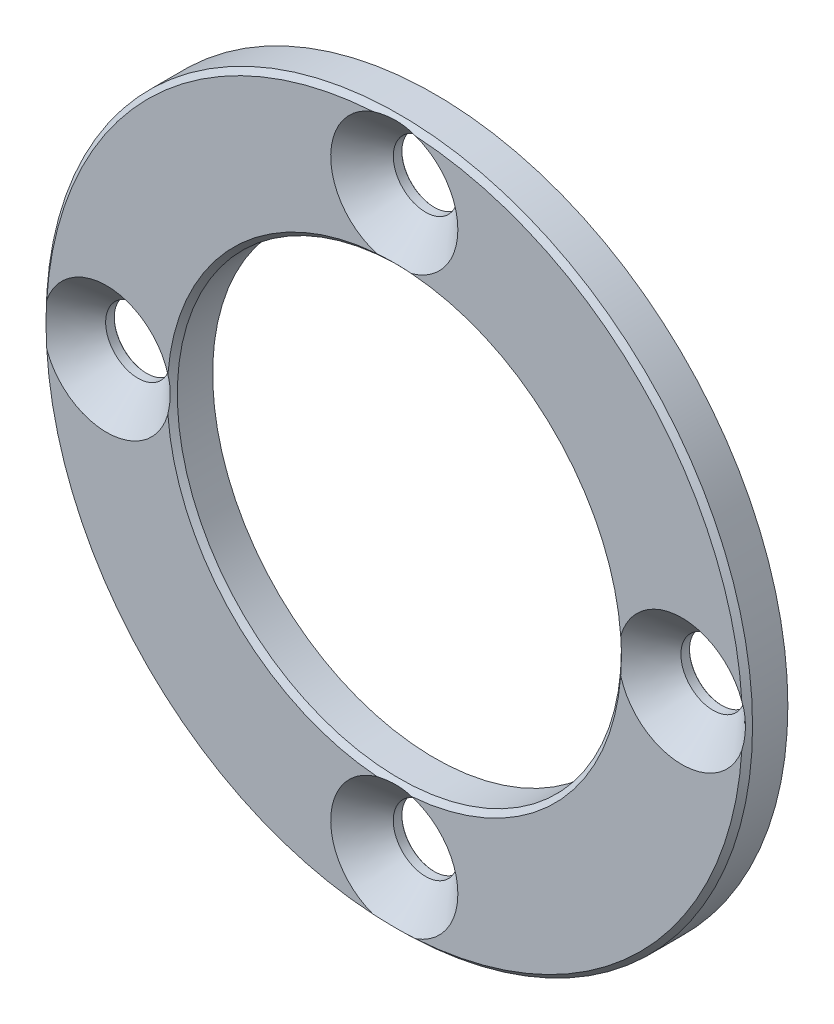
ISO-10303-21;
HEADER;
FILE_DESCRIPTION(('STEP AP214'),'2;1');
FILE_NAME('part.step','',(''),(''),'','','');
FILE_SCHEMA(('AUTOMOTIVE_DESIGN { 1 0 10303 214 1 1 1 1 }'));
ENDSEC;
DATA;
#1=APPLICATION_CONTEXT('core data for automotive mechanical design processes');
#2=APPLICATION_PROTOCOL_DEFINITION('international standard','automotive_design',2000,#1);
#3=PRODUCT_CONTEXT('',#1,'mechanical');
#4=PRODUCT('Part','Part','',(#3));
#5=PRODUCT_RELATED_PRODUCT_CATEGORY('part','',(#4));
#6=PRODUCT_DEFINITION_FORMATION('','',#4);
#7=PRODUCT_DEFINITION_CONTEXT('part definition',#1,'design');
#8=PRODUCT_DEFINITION('design','',#6,#7);
#9=PRODUCT_DEFINITION_SHAPE('','',#8);
#10=(LENGTH_UNIT() NAMED_UNIT(*) SI_UNIT(.MILLI.,.METRE.));
#11=(NAMED_UNIT(*) PLANE_ANGLE_UNIT() SI_UNIT($,.RADIAN.));
#12=(NAMED_UNIT(*) SI_UNIT($,.STERADIAN.) SOLID_ANGLE_UNIT());
#13=UNCERTAINTY_MEASURE_WITH_UNIT(LENGTH_MEASURE(1.E-05),#10,'distance_accuracy_value','');
#14=(GEOMETRIC_REPRESENTATION_CONTEXT(3) GLOBAL_UNCERTAINTY_ASSIGNED_CONTEXT((#13)) GLOBAL_UNIT_ASSIGNED_CONTEXT((#10,
#11,#12)) REPRESENTATION_CONTEXT('',''));
#15=CARTESIAN_POINT('',(0.,0.,0.));
#16=DIRECTION('',(0.,0.,1.));
#17=DIRECTION('',(1.,0.,0.));
#18=AXIS2_PLACEMENT_3D('',#15,#16,#17);
#19=CARTESIAN_POINT('',(0.,0.,2.));
#20=DIRECTION('',(0.,0.,1.));
#21=DIRECTION('',(1.,0.,0.));
#22=AXIS2_PLACEMENT_3D('',#19,#20,#21);
#23=PLANE('',#22);
#24=CARTESIAN_POINT('',(0.,14.25,2.));
#25=DIRECTION('',(0.,0.,1.));
#26=DIRECTION('',(1.,0.,0.));
#27=AXIS2_PLACEMENT_3D('',#24,#25,#26);
#28=CIRCLE('',#27,3.15);
#29=CARTESIAN_POINT('',(-1.05624940787408,17.2176315789474,2.));
#30=VERTEX_POINT('',#29);
#31=CARTESIAN_POINT('',(-0.852784708471473,11.2176315789474,2.));
#32=VERTEX_POINT('',#31);
#33=EDGE_CURVE('E149',#30,#32,#28,.T.);
#34=ORIENTED_EDGE('',*,*,#33,.F.);
#35=CARTESIAN_POINT('',(0.,0.,2.));
#36=DIRECTION('',(0.,0.,1.));
#37=DIRECTION('',(1.,0.,0.));
#38=AXIS2_PLACEMENT_3D('',#35,#36,#37);
#39=CIRCLE('',#38,17.25);
#40=CARTESIAN_POINT('',(-17.2176315789474,1.05624940787408,2.));
#41=VERTEX_POINT('',#40);
#42=EDGE_CURVE('E155',#30,#41,#39,.T.);
#43=ORIENTED_EDGE('',*,*,#42,.T.);
#44=CARTESIAN_POINT('',(-14.25,0.,2.));
#45=DIRECTION('',(0.,0.,1.));
#46=DIRECTION('',(1.,0.,0.));
#47=AXIS2_PLACEMENT_3D('',#44,#45,#46);
#48=CIRCLE('',#47,3.15);
#49=CARTESIAN_POINT('',(-11.2176315789474,0.852784708471474,2.));
#50=VERTEX_POINT('',#49);
#51=EDGE_CURVE('E298',#50,#41,#48,.T.);
#52=ORIENTED_EDGE('',*,*,#51,.F.);
#53=CARTESIAN_POINT('',(0.,0.,2.));
#54=DIRECTION('',(0.,0.,1.));
#55=DIRECTION('',(1.,0.,0.));
#56=AXIS2_PLACEMENT_3D('',#53,#54,#55);
#57=CIRCLE('',#56,11.25);
#58=EDGE_CURVE('E277',#50,#32,#57,.F.);
#59=ORIENTED_EDGE('',*,*,#58,.T.);
#60=EDGE_LOOP('',(#34,#43,#52,#59));
#61=FACE_BOUND('',#60,.T.);
#62=ADVANCED_FACE('F43',(#61),#23,.T.);
#63=CARTESIAN_POINT('',(-17.2176315789474,-1.05624940787408,2.));
#64=VERTEX_POINT('',#63);
#65=CARTESIAN_POINT('',(-11.2176315789474,-0.852784708471473,2.));
#66=VERTEX_POINT('',#65);
#67=EDGE_CURVE('E300',#64,#66,#48,.T.);
#68=ORIENTED_EDGE('',*,*,#67,.F.);
#69=CARTESIAN_POINT('',(0.,0.,2.));
#70=DIRECTION('',(0.,0.,1.));
#71=DIRECTION('',(1.,0.,0.));
#72=AXIS2_PLACEMENT_3D('',#69,#70,#71);
#73=CIRCLE('',#72,17.25);
#74=CARTESIAN_POINT('',(-1.05624940787408,-17.2176315789474,2.));
#75=VERTEX_POINT('',#74);
#76=EDGE_CURVE('E268',#64,#75,#73,.T.);
#77=ORIENTED_EDGE('',*,*,#76,.T.);
#78=CARTESIAN_POINT('',(0.,-14.25,2.));
#79=DIRECTION('',(0.,0.,1.));
#80=DIRECTION('',(1.,0.,0.));
#81=AXIS2_PLACEMENT_3D('',#78,#79,#80);
#82=CIRCLE('',#81,3.15);
#83=CARTESIAN_POINT('',(-0.852784708471472,-11.2176315789474,2.));
#84=VERTEX_POINT('',#83);
#85=EDGE_CURVE('E312',#84,#75,#82,.T.);
#86=ORIENTED_EDGE('',*,*,#85,.F.);
#87=CARTESIAN_POINT('',(0.,0.,2.));
#88=DIRECTION('',(0.,0.,1.));
#89=DIRECTION('',(1.,0.,0.));
#90=AXIS2_PLACEMENT_3D('',#87,#88,#89);
#91=CIRCLE('',#90,11.25);
#92=EDGE_CURVE('E139',#84,#66,#91,.F.);
#93=ORIENTED_EDGE('',*,*,#92,.T.);
#94=EDGE_LOOP('',(#68,#77,#86,#93));
#95=FACE_BOUND('',#94,.T.);
#96=ADVANCED_FACE('F374',(#95),#23,.T.);
#97=CARTESIAN_POINT('',(1.05624940787408,-17.2176315789474,2.));
#98=VERTEX_POINT('',#97);
#99=CARTESIAN_POINT('',(0.852784708471475,-11.2176315789474,2.));
#100=VERTEX_POINT('',#99);
#101=EDGE_CURVE('E313',#98,#100,#82,.T.);
#102=ORIENTED_EDGE('',*,*,#101,.F.);
#103=CARTESIAN_POINT('',(0.,0.,2.));
#104=DIRECTION('',(0.,0.,1.));
#105=DIRECTION('',(1.,0.,0.));
#106=AXIS2_PLACEMENT_3D('',#103,#104,#105);
#107=CIRCLE('',#106,17.25);
#108=CARTESIAN_POINT('',(17.2176315789474,-1.05624940787407,2.));
#109=VERTEX_POINT('',#108);
#110=EDGE_CURVE('E138',#98,#109,#107,.T.);
#111=ORIENTED_EDGE('',*,*,#110,.T.);
#112=CARTESIAN_POINT('',(14.25,0.,2.));
#113=DIRECTION('',(0.,0.,1.));
#114=DIRECTION('',(1.,0.,0.));
#115=AXIS2_PLACEMENT_3D('',#112,#113,#114);
#116=CIRCLE('',#115,3.15);
#117=CARTESIAN_POINT('',(11.2176315789474,-0.852784708471466,2.));
#118=VERTEX_POINT('',#117);
#119=EDGE_CURVE('E328',#118,#109,#116,.T.);
#120=ORIENTED_EDGE('',*,*,#119,.F.);
#121=CARTESIAN_POINT('',(0.,0.,2.));
#122=DIRECTION('',(0.,0.,1.));
#123=DIRECTION('',(1.,0.,0.));
#124=AXIS2_PLACEMENT_3D('',#121,#122,#123);
#125=CIRCLE('',#124,11.25);
#126=EDGE_CURVE('E283',#118,#100,#125,.F.);
#127=ORIENTED_EDGE('',*,*,#126,.T.);
#128=EDGE_LOOP('',(#102,#111,#120,#127));
#129=FACE_BOUND('',#128,.T.);
#130=ADVANCED_FACE('F378',(#129),#23,.T.);
#131=CARTESIAN_POINT('',(17.2176315789474,1.05624940787407,2.));
#132=VERTEX_POINT('',#131);
#133=CARTESIAN_POINT('',(11.2176315789474,0.852784708471467,2.));
#134=VERTEX_POINT('',#133);
#135=EDGE_CURVE('E133',#132,#134,#116,.T.);
#136=ORIENTED_EDGE('',*,*,#135,.F.);
#137=CARTESIAN_POINT('',(0.,0.,2.));
#138=DIRECTION('',(0.,0.,1.));
#139=DIRECTION('',(1.,0.,0.));
#140=AXIS2_PLACEMENT_3D('',#137,#138,#139);
#141=CIRCLE('',#140,17.25);
#142=CARTESIAN_POINT('',(1.05624940787408,17.2176315789474,2.));
#143=VERTEX_POINT('',#142);
#144=EDGE_CURVE('E127',#132,#143,#141,.T.);
#145=ORIENTED_EDGE('',*,*,#144,.T.);
#146=CARTESIAN_POINT('',(0.852784708471473,11.2176315789474,2.));
#147=VERTEX_POINT('',#146);
#148=EDGE_CURVE('E130',#147,#143,#28,.T.);
#149=ORIENTED_EDGE('',*,*,#148,.F.);
#150=CARTESIAN_POINT('',(0.,0.,2.));
#151=DIRECTION('',(0.,0.,1.));
#152=DIRECTION('',(1.,0.,0.));
#153=AXIS2_PLACEMENT_3D('',#150,#151,#152);
#154=CIRCLE('',#153,11.25);
#155=EDGE_CURVE('E280',#147,#134,#154,.F.);
#156=ORIENTED_EDGE('',*,*,#155,.T.);
#157=EDGE_LOOP('',(#136,#145,#149,#156));
#158=FACE_BOUND('',#157,.T.);
#159=ADVANCED_FACE('F129',(#158),#23,.T.);
#160=CARTESIAN_POINT('',(0.,0.,0.));
#161=DIRECTION('',(0.,0.,1.));
#162=DIRECTION('',(1.,0.,0.));
#163=AXIS2_PLACEMENT_3D('',#160,#161,#162);
#164=PLANE('',#163);
#165=CARTESIAN_POINT('',(0.,14.25,0.));
#166=DIRECTION('',(0.,0.,1.));
#167=DIRECTION('',(1.,0.,0.));
#168=AXIS2_PLACEMENT_3D('',#165,#166,#167);
#169=CIRCLE('',#168,1.625);
#170=CARTESIAN_POINT('',(1.625,14.25,0.));
#171=VERTEX_POINT('',#170);
#172=EDGE_CURVE('E150',#171,#171,#169,.T.);
#173=ORIENTED_EDGE('',*,*,#172,.T.);
#174=EDGE_LOOP('',(#173));
#175=FACE_BOUND('',#174,.T.);
#176=CARTESIAN_POINT('',(14.25,0.,0.));
#177=DIRECTION('',(0.,0.,1.));
#178=DIRECTION('',(1.,0.,0.));
#179=AXIS2_PLACEMENT_3D('',#176,#177,#178);
#180=CIRCLE('',#179,1.625);
#181=CARTESIAN_POINT('',(15.875,0.,0.));
#182=VERTEX_POINT('',#181);
#183=EDGE_CURVE('E329',#182,#182,#180,.T.);
#184=ORIENTED_EDGE('',*,*,#183,.T.);
#185=EDGE_LOOP('',(#184));
#186=FACE_BOUND('',#185,.T.);
#187=CARTESIAN_POINT('',(0.,-14.25,0.));
#188=DIRECTION('',(0.,0.,1.));
#189=DIRECTION('',(1.,0.,0.));
#190=AXIS2_PLACEMENT_3D('',#187,#188,#189);
#191=CIRCLE('',#190,1.625);
#192=CARTESIAN_POINT('',(1.625,-14.25,0.));
#193=VERTEX_POINT('',#192);
#194=EDGE_CURVE('E316',#193,#193,#191,.T.);
#195=ORIENTED_EDGE('',*,*,#194,.T.);
#196=EDGE_LOOP('',(#195));
#197=FACE_BOUND('',#196,.T.);
#198=CARTESIAN_POINT('',(-14.25,0.,0.));
#199=DIRECTION('',(0.,0.,1.));
#200=DIRECTION('',(1.,0.,0.));
#201=AXIS2_PLACEMENT_3D('',#198,#199,#200);
#202=CIRCLE('',#201,1.625);
#203=CARTESIAN_POINT('',(-12.625,0.,0.));
#204=VERTEX_POINT('',#203);
#205=EDGE_CURVE('E301',#204,#204,#202,.T.);
#206=ORIENTED_EDGE('',*,*,#205,.T.);
#207=EDGE_LOOP('',(#206));
#208=FACE_BOUND('',#207,.T.);
#209=CARTESIAN_POINT('',(0.,0.,0.));
#210=DIRECTION('',(0.,0.,1.));
#211=DIRECTION('',(1.,0.,0.));
#212=AXIS2_PLACEMENT_3D('',#209,#210,#211);
#213=CIRCLE('',#212,17.5);
#214=CARTESIAN_POINT('',(17.5,0.,0.));
#215=VERTEX_POINT('',#214);
#216=EDGE_CURVE('E286',#215,#215,#213,.T.);
#217=ORIENTED_EDGE('',*,*,#216,.F.);
#218=EDGE_LOOP('',(#217));
#219=FACE_BOUND('',#218,.T.);
#220=CARTESIAN_POINT('',(0.,0.,0.));
#221=DIRECTION('',(0.,0.,1.));
#222=DIRECTION('',(1.,0.,0.));
#223=AXIS2_PLACEMENT_3D('',#220,#221,#222);
#224=CIRCLE('',#223,11.);
#225=CARTESIAN_POINT('',(11.,0.,0.));
#226=VERTEX_POINT('',#225);
#227=EDGE_CURVE('E289',#226,#226,#224,.T.);
#228=ORIENTED_EDGE('',*,*,#227,.T.);
#229=EDGE_LOOP('',(#228));
#230=FACE_BOUND('',#229,.T.);
#231=ADVANCED_FACE('F342',(#175,#186,#197,#208,#219,#230),#164,.F.);
#232=CARTESIAN_POINT('',(0.,0.,2.));
#233=DIRECTION('',(0.,0.,-1.));
#234=DIRECTION('',(-1.,0.,0.));
#235=AXIS2_PLACEMENT_3D('',#232,#233,#234);
#236=CYLINDRICAL_SURFACE('',#235,17.5);
#237=CARTESIAN_POINT('',(0.,0.,1.75));
#238=DIRECTION('',(0.,0.,1.));
#239=DIRECTION('',(1.,0.,0.));
#240=AXIS2_PLACEMENT_3D('',#237,#238,#239);
#241=CIRCLE('',#240,17.5);
#242=CARTESIAN_POINT('',(17.5,0.,1.75));
#243=VERTEX_POINT('',#242);
#244=EDGE_CURVE('E53',#243,#243,#241,.F.);
#245=ORIENTED_EDGE('',*,*,#244,.T.);
#246=EDGE_LOOP('',(#245));
#247=FACE_BOUND('',#246,.T.);
#248=ORIENTED_EDGE('',*,*,#216,.T.);
#249=EDGE_LOOP('',(#248));
#250=FACE_BOUND('',#249,.T.);
#251=ADVANCED_FACE('F349',(#247,#250),#236,.T.);
#252=CARTESIAN_POINT('',(0.,0.,2.));
#253=DIRECTION('',(0.,0.,-1.));
#254=DIRECTION('',(-1.,0.,0.));
#255=AXIS2_PLACEMENT_3D('',#252,#253,#254);
#256=CYLINDRICAL_SURFACE('',#255,11.);
#257=CARTESIAN_POINT('',(0.,0.,1.75));
#258=DIRECTION('',(0.,0.,1.));
#259=DIRECTION('',(1.,0.,0.));
#260=AXIS2_PLACEMENT_3D('',#257,#258,#259);
#261=CIRCLE('',#260,11.);
#262=CARTESIAN_POINT('',(11.,0.,1.75));
#263=VERTEX_POINT('',#262);
#264=EDGE_CURVE('E11',#263,#263,#261,.T.);
#265=ORIENTED_EDGE('',*,*,#264,.T.);
#266=EDGE_LOOP('',(#265));
#267=FACE_BOUND('',#266,.T.);
#268=ORIENTED_EDGE('',*,*,#227,.F.);
#269=EDGE_LOOP('',(#268));
#270=FACE_BOUND('',#269,.T.);
#271=ADVANCED_FACE('F361',(#267,#270),#256,.F.);
#272=CARTESIAN_POINT('',(-14.25,0.,0.0250000000000003));
#273=DIRECTION('',(0.,0.,-1.));
#274=DIRECTION('',(-1.,0.,0.));
#275=AXIS2_PLACEMENT_3D('',#272,#273,#274);
#276=CONICAL_SURFACE('',#275,1.6,0.785398163397457);
#277=ORIENTED_EDGE('',*,*,#205,.F.);
#278=EDGE_LOOP('',(#277));
#279=FACE_BOUND('',#278,.T.);
#280=CARTESIAN_POINT('',(-14.25,0.,0.0250000000000003));
#281=DIRECTION('',(0.,0.,1.));
#282=DIRECTION('',(1.,0.,0.));
#283=AXIS2_PLACEMENT_3D('',#280,#281,#282);
#284=CIRCLE('',#283,1.6);
#285=CARTESIAN_POINT('',(-12.65,0.,0.0250000000000003));
#286=VERTEX_POINT('',#285);
#287=EDGE_CURVE('E292',#286,#286,#284,.T.);
#288=ORIENTED_EDGE('',*,*,#287,.T.);
#289=EDGE_LOOP('',(#288));
#290=FACE_BOUND('',#289,.T.);
#291=ADVANCED_FACE('F363',(#279,#290),#276,.F.);
#292=CARTESIAN_POINT('',(-14.25,0.,2.));
#293=DIRECTION('',(0.,0.,1.));
#294=DIRECTION('',(1.,0.,0.));
#295=AXIS2_PLACEMENT_3D('',#292,#293,#294);
#296=CYLINDRICAL_SURFACE('',#295,1.6);
#297=ORIENTED_EDGE('',*,*,#287,.F.);
#298=EDGE_LOOP('',(#297));
#299=FACE_BOUND('',#298,.T.);
#300=CARTESIAN_POINT('',(-14.25,0.,0.45));
#301=DIRECTION('',(0.,0.,1.));
#302=DIRECTION('',(1.,0.,0.));
#303=AXIS2_PLACEMENT_3D('',#300,#301,#302);
#304=CIRCLE('',#303,1.6);
#305=CARTESIAN_POINT('',(-12.65,0.,0.45));
#306=VERTEX_POINT('',#305);
#307=EDGE_CURVE('E295',#306,#306,#304,.T.);
#308=ORIENTED_EDGE('',*,*,#307,.T.);
#309=EDGE_LOOP('',(#308));
#310=FACE_BOUND('',#309,.T.);
#311=ADVANCED_FACE('F248',(#299,#310),#296,.F.);
#312=CARTESIAN_POINT('',(-14.25,0.,2.));
#313=DIRECTION('',(0.,0.,1.));
#314=DIRECTION('',(1.,0.,0.));
#315=AXIS2_PLACEMENT_3D('',#312,#313,#314);
#316=CONICAL_SURFACE('',#315,3.15,0.785398163397449);
#317=ORIENTED_EDGE('',*,*,#307,.F.);
#318=EDGE_LOOP('',(#317));
#319=FACE_BOUND('',#318,.T.);
#320=ORIENTED_EDGE('',*,*,#51,.T.);
#321=CARTESIAN_POINT('',(-17.2176315789474,1.05624940787408,2.));
#322=CARTESIAN_POINT('',(-17.2423305317793,0.935563844195699,1.98274705499936));
#323=CARTESIAN_POINT('',(-17.2629079946694,0.8135997368502,1.96837309197479));
#324=CARTESIAN_POINT('',(-17.2955299071514,0.567926341024394,1.94558572668355));
#325=CARTESIAN_POINT('',(-17.3075701297683,0.44421621892616,1.93717527708322));
#326=CARTESIAN_POINT('',(-17.3226464780269,0.198526364411612,1.92664400437944));
#327=CARTESIAN_POINT('',(-17.3258619995738,0.0765630978836639,1.92439786796129));
#328=CARTESIAN_POINT('',(-17.3237448866351,-0.167187756970835,1.92587673358402));
#329=CARTESIAN_POINT('',(-17.3184170219598,-0.288975405355205,1.92959840377203));
#330=CARTESIAN_POINT('',(-17.30034969676,-0.51860911910319,1.94221896182742));
#331=CARTESIAN_POINT('',(-17.288461314569,-0.626556770387878,1.95052334644796));
#332=CARTESIAN_POINT('',(-17.2580342767816,-0.842089249718741,1.97177752725457));
#333=CARTESIAN_POINT('',(-17.2394345480596,-0.949661273353213,1.98476998481498));
#334=CARTESIAN_POINT('',(-17.2176315789474,-1.05624940787408,2.));
#335=B_SPLINE_CURVE_WITH_KNOTS('',3,(#321,#322,#323,#324,#325,#326,#327,#328,#329,#330,#331,
#332,#333,#334),.UNSPECIFIED.,.F.,.F.,(4,2,2,2,2,2,4),(0.,0.373096657027261,0.746377913647571,
1.11201252652992,1.47744307505201,1.80389911672499,2.13340408830665),.UNSPECIFIED.);
#336=EDGE_CURVE('E73',#41,#64,#335,.T.);
#337=ORIENTED_EDGE('',*,*,#336,.T.);
#338=ORIENTED_EDGE('',*,*,#67,.T.);
#339=CARTESIAN_POINT('',(-11.2176315789474,-0.852784708471473,2.));
#340=CARTESIAN_POINT('',(-11.2116706721064,-0.792861181333929,1.9895132195926));
#341=CARTESIAN_POINT('',(-11.2063033885988,-0.732700887651865,1.98007077633692));
#342=CARTESIAN_POINT('',(-11.1967994686457,-0.611977390181435,1.96335091695972));
#343=CARTESIAN_POINT('',(-11.1926629655724,-0.551414143453911,1.9560737354748));
#344=CARTESIAN_POINT('',(-11.1821649457678,-0.369218639516163,1.93760499674162));
#345=CARTESIAN_POINT('',(-11.1777175941952,-0.247107192903553,1.92978095254196));
#346=CARTESIAN_POINT('',(-11.1741489333632,-0.00460473866626139,1.92350275314375));
#347=CARTESIAN_POINT('',(-11.1749408029969,0.115781343393012,1.92489585711283));
#348=CARTESIAN_POINT('',(-11.1816121257596,0.35590615911943,1.9366324434576));
#349=CARTESIAN_POINT('',(-11.1874880123912,0.475645287392892,1.94696965143973));
#350=CARTESIAN_POINT('',(-11.1987939679737,0.637815275294871,1.9668597584683));
#351=CARTESIAN_POINT('',(-11.202121714313,0.680883099531113,1.97271412702045));
#352=CARTESIAN_POINT('',(-11.2094079243818,0.766935604562902,1.98553245954293));
#353=CARTESIAN_POINT('',(-11.2133682879666,0.809919627090163,1.9924997658515));
#354=CARTESIAN_POINT('',(-11.2176315789474,0.852784708471474,2.));
#355=B_SPLINE_CURVE_WITH_KNOTS('',3,(#339,#340,#341,#342,#343,#344,#345,#346,#347,#348,#349,
#350,#351,#352,#353,#354),.UNSPECIFIED.,.F.,.F.,(4,2,2,2,2,2,2,4),(0.,0.183352767396062,
0.366725396415032,0.733551757360662,1.0943147033746,1.45482477496485,1.58558468082394,
1.71674493049115),.UNSPECIFIED.);
#356=EDGE_CURVE('E63',#66,#50,#355,.T.);
#357=ORIENTED_EDGE('',*,*,#356,.T.);
#358=EDGE_LOOP('',(#320,#337,#338,#357));
#359=FACE_BOUND('',#358,.T.);
#360=ADVANCED_FACE('F243',(#319,#359),#316,.F.);
#361=CARTESIAN_POINT('',(0.,-14.25,0.0250000000000003));
#362=DIRECTION('',(0.,0.,-1.));
#363=DIRECTION('',(-1.,0.,0.));
#364=AXIS2_PLACEMENT_3D('',#361,#362,#363);
#365=CONICAL_SURFACE('',#364,1.6,0.785398163397448);
#366=ORIENTED_EDGE('',*,*,#194,.F.);
#367=EDGE_LOOP('',(#366));
#368=FACE_BOUND('',#367,.T.);
#369=CARTESIAN_POINT('',(0.,-14.25,0.0250000000000003));
#370=DIRECTION('',(0.,0.,1.));
#371=DIRECTION('',(1.,0.,0.));
#372=AXIS2_PLACEMENT_3D('',#369,#370,#371);
#373=CIRCLE('',#372,1.6);
#374=CARTESIAN_POINT('',(1.6,-14.25,0.0250000000000003));
#375=VERTEX_POINT('',#374);
#376=EDGE_CURVE('E304',#375,#375,#373,.T.);
#377=ORIENTED_EDGE('',*,*,#376,.T.);
#378=EDGE_LOOP('',(#377));
#379=FACE_BOUND('',#378,.T.);
#380=ADVANCED_FACE('F239',(#368,#379),#365,.F.);
#381=CARTESIAN_POINT('',(0.,-14.25,2.));
#382=DIRECTION('',(0.,0.,1.));
#383=DIRECTION('',(1.,0.,0.));
#384=AXIS2_PLACEMENT_3D('',#381,#382,#383);
#385=CYLINDRICAL_SURFACE('',#384,1.6);
#386=ORIENTED_EDGE('',*,*,#376,.F.);
#387=EDGE_LOOP('',(#386));
#388=FACE_BOUND('',#387,.T.);
#389=CARTESIAN_POINT('',(0.,-14.25,0.45));
#390=DIRECTION('',(0.,0.,1.));
#391=DIRECTION('',(1.,0.,0.));
#392=AXIS2_PLACEMENT_3D('',#389,#390,#391);
#393=CIRCLE('',#392,1.6);
#394=CARTESIAN_POINT('',(1.6,-14.25,0.45));
#395=VERTEX_POINT('',#394);
#396=EDGE_CURVE('E308',#395,#395,#393,.T.);
#397=ORIENTED_EDGE('',*,*,#396,.T.);
#398=EDGE_LOOP('',(#397));
#399=FACE_BOUND('',#398,.T.);
#400=ADVANCED_FACE('F234',(#388,#399),#385,.F.);
#401=CARTESIAN_POINT('',(0.,-14.25,2.));
#402=DIRECTION('',(0.,0.,1.));
#403=DIRECTION('',(1.,0.,0.));
#404=AXIS2_PLACEMENT_3D('',#401,#402,#403);
#405=CONICAL_SURFACE('',#404,3.15,0.785398163397449);
#406=ORIENTED_EDGE('',*,*,#396,.F.);
#407=EDGE_LOOP('',(#406));
#408=FACE_BOUND('',#407,.T.);
#409=ORIENTED_EDGE('',*,*,#85,.T.);
#410=CARTESIAN_POINT('',(-1.05624940787408,-17.2176315789474,2.));
#411=CARTESIAN_POINT('',(-0.935563844195696,-17.2423305317793,1.98274705499936));
#412=CARTESIAN_POINT('',(-0.813599736850196,-17.2629079946694,1.96837309197479));
#413=CARTESIAN_POINT('',(-0.56792634102439,-17.2955299071514,1.94558572668355));
#414=CARTESIAN_POINT('',(-0.444216218926157,-17.3075701297683,1.93717527708322));
#415=CARTESIAN_POINT('',(-0.198526364411608,-17.3226464780269,1.92664400437944));
#416=CARTESIAN_POINT('',(-0.0765630978836598,-17.3258619995738,1.92439786796129));
#417=CARTESIAN_POINT('',(0.167187756970839,-17.3237448866351,1.92587673358402));
#418=CARTESIAN_POINT('',(0.28897540535521,-17.3184170219598,1.92959840377203));
#419=CARTESIAN_POINT('',(0.518609119103194,-17.30034969676,1.94221896182742));
#420=CARTESIAN_POINT('',(0.626556770387882,-17.288461314569,1.95052334644796));
#421=CARTESIAN_POINT('',(0.842089249718744,-17.2580342767816,1.97177752725457));
#422=CARTESIAN_POINT('',(0.949661273353216,-17.2394345480596,1.98476998481498));
#423=CARTESIAN_POINT('',(1.05624940787408,-17.2176315789474,2.));
#424=B_SPLINE_CURVE_WITH_KNOTS('',3,(#410,#411,#412,#413,#414,#415,#416,#417,#418,#419,#420,
#421,#422,#423),.UNSPECIFIED.,.F.,.F.,(4,2,2,2,2,2,4),(0.,0.373096657027261,0.746377913647572,
1.11201252652992,1.47744307505201,1.80389911672499,2.13340408830665),.UNSPECIFIED.);
#425=EDGE_CURVE('E208',#75,#98,#424,.T.);
#426=ORIENTED_EDGE('',*,*,#425,.T.);
#427=ORIENTED_EDGE('',*,*,#101,.T.);
#428=CARTESIAN_POINT('',(0.852784708471475,-11.2176315789474,2.));
#429=CARTESIAN_POINT('',(0.79286118133393,-11.2116706721064,1.9895132195926));
#430=CARTESIAN_POINT('',(0.732700887651866,-11.2063033885988,1.98007077633692));
#431=CARTESIAN_POINT('',(0.611977390181437,-11.1967994686457,1.96335091695972));
#432=CARTESIAN_POINT('',(0.551414143453914,-11.1926629655724,1.95607373547481));
#433=CARTESIAN_POINT('',(0.369218639516165,-11.1821649457678,1.93760499674161));
#434=CARTESIAN_POINT('',(0.247107192903555,-11.1777175941952,1.92978095254196));
#435=CARTESIAN_POINT('',(0.00460473866626384,-11.1741489333632,1.92350275314375));
#436=CARTESIAN_POINT('',(-0.11578134339301,-11.1749408029969,1.92489585711283));
#437=CARTESIAN_POINT('',(-0.355906159119427,-11.1816121257596,1.9366324434576));
#438=CARTESIAN_POINT('',(-0.475645287392889,-11.1874880123912,1.94696965143973));
#439=CARTESIAN_POINT('',(-0.637815275294868,-11.1987939679737,1.9668597584683));
#440=CARTESIAN_POINT('',(-0.68088309953111,-11.202121714313,1.97271412702044));
#441=CARTESIAN_POINT('',(-0.766935604562899,-11.2094079243818,1.98553245954293));
#442=CARTESIAN_POINT('',(-0.809919627090161,-11.2133682879666,1.99249976585151));
#443=CARTESIAN_POINT('',(-0.852784708471472,-11.2176315789474,2.));
#444=B_SPLINE_CURVE_WITH_KNOTS('',3,(#428,#429,#430,#431,#432,#433,#434,#435,#436,#437,#438,
#439,#440,#441,#442,#443),.UNSPECIFIED.,.F.,.F.,(4,2,2,2,2,2,2,4),(0.,0.183352767396062,
0.366725396415031,0.733551757360662,1.0943147033746,1.45482477496485,1.58558468082394,
1.71674493049115),.UNSPECIFIED.);
#445=EDGE_CURVE('E213',#100,#84,#444,.T.);
#446=ORIENTED_EDGE('',*,*,#445,.T.);
#447=EDGE_LOOP('',(#409,#426,#427,#446));
#448=FACE_BOUND('',#447,.T.);
#449=ADVANCED_FACE('F229',(#408,#448),#405,.F.);
#450=CARTESIAN_POINT('',(14.25,0.,0.0250000000000003));
#451=DIRECTION('',(0.,0.,-1.));
#452=DIRECTION('',(-1.,0.,0.));
#453=AXIS2_PLACEMENT_3D('',#450,#451,#452);
#454=CONICAL_SURFACE('',#453,1.6,0.785398163397457);
#455=ORIENTED_EDGE('',*,*,#183,.F.);
#456=EDGE_LOOP('',(#455));
#457=FACE_BOUND('',#456,.T.);
#458=CARTESIAN_POINT('',(14.25,0.,0.0250000000000003));
#459=DIRECTION('',(0.,0.,1.));
#460=DIRECTION('',(1.,0.,0.));
#461=AXIS2_PLACEMENT_3D('',#458,#459,#460);
#462=CIRCLE('',#461,1.6);
#463=CARTESIAN_POINT('',(15.85,0.,0.0250000000000003));
#464=VERTEX_POINT('',#463);
#465=EDGE_CURVE('E320',#464,#464,#462,.T.);
#466=ORIENTED_EDGE('',*,*,#465,.T.);
#467=EDGE_LOOP('',(#466));
#468=FACE_BOUND('',#467,.T.);
#469=ADVANCED_FACE('F233',(#457,#468),#454,.F.);
#470=CARTESIAN_POINT('',(14.25,0.,2.));
#471=DIRECTION('',(0.,0.,1.));
#472=DIRECTION('',(1.,0.,0.));
#473=AXIS2_PLACEMENT_3D('',#470,#471,#472);
#474=CYLINDRICAL_SURFACE('',#473,1.6);
#475=ORIENTED_EDGE('',*,*,#465,.F.);
#476=EDGE_LOOP('',(#475));
#477=FACE_BOUND('',#476,.T.);
#478=CARTESIAN_POINT('',(14.25,0.,0.45));
#479=DIRECTION('',(0.,0.,1.));
#480=DIRECTION('',(1.,0.,0.));
#481=AXIS2_PLACEMENT_3D('',#478,#479,#480);
#482=CIRCLE('',#481,1.6);
#483=CARTESIAN_POINT('',(15.85,0.,0.45));
#484=VERTEX_POINT('',#483);
#485=EDGE_CURVE('E324',#484,#484,#482,.T.);
#486=ORIENTED_EDGE('',*,*,#485,.T.);
#487=EDGE_LOOP('',(#486));
#488=FACE_BOUND('',#487,.T.);
#489=ADVANCED_FACE('F189',(#477,#488),#474,.F.);
#490=CARTESIAN_POINT('',(14.25,0.,2.));
#491=DIRECTION('',(0.,0.,1.));
#492=DIRECTION('',(1.,0.,0.));
#493=AXIS2_PLACEMENT_3D('',#490,#491,#492);
#494=CONICAL_SURFACE('',#493,3.15,0.785398163397448);
#495=ORIENTED_EDGE('',*,*,#485,.F.);
#496=EDGE_LOOP('',(#495));
#497=FACE_BOUND('',#496,.T.);
#498=ORIENTED_EDGE('',*,*,#119,.T.);
#499=CARTESIAN_POINT('',(17.2176315789474,-1.05624940787407,2.));
#500=CARTESIAN_POINT('',(17.2423305317793,-0.935563844195687,1.98274705499936));
#501=CARTESIAN_POINT('',(17.2629079946694,-0.813599736850187,1.96837309197479));
#502=CARTESIAN_POINT('',(17.2955299071514,-0.567926341024381,1.94558572668355));
#503=CARTESIAN_POINT('',(17.3075701297683,-0.444216218926148,1.93717527708322));
#504=CARTESIAN_POINT('',(17.3226464780269,-0.198526364411601,1.92664400437943));
#505=CARTESIAN_POINT('',(17.3258619995738,-0.0765630978836526,1.92439786796129));
#506=CARTESIAN_POINT('',(17.3237448866351,0.167187756970846,1.92587673358402));
#507=CARTESIAN_POINT('',(17.3184170219598,0.288975405355216,1.92959840377203));
#508=CARTESIAN_POINT('',(17.30034969676,0.518609119103198,1.94221896182742));
#509=CARTESIAN_POINT('',(17.288461314569,0.626556770387884,1.95052334644796));
#510=CARTESIAN_POINT('',(17.2580342767816,0.84208924971874,1.97177752725457));
#511=CARTESIAN_POINT('',(17.2394345480596,0.949661273353209,1.98476998481498));
#512=CARTESIAN_POINT('',(17.2176315789474,1.05624940787407,2.));
#513=B_SPLINE_CURVE_WITH_KNOTS('',3,(#499,#500,#501,#502,#503,#504,#505,#506,#507,#508,#509,
#510,#511,#512),.UNSPECIFIED.,.F.,.F.,(4,2,2,2,2,2,4),(0.,0.373096657027262,0.746377913647571,
1.11201252652992,1.47744307505201,1.80389911672498,2.13340408830663),.UNSPECIFIED.);
#514=EDGE_CURVE('E160',#109,#132,#513,.T.);
#515=ORIENTED_EDGE('',*,*,#514,.T.);
#516=ORIENTED_EDGE('',*,*,#135,.T.);
#517=CARTESIAN_POINT('',(11.2176315789474,0.852784708471467,2.));
#518=CARTESIAN_POINT('',(11.2116706721064,0.792861181333923,1.9895132195926));
#519=CARTESIAN_POINT('',(11.2063033885988,0.732700887651859,1.98007077633692));
#520=CARTESIAN_POINT('',(11.1967994686457,0.61197739018143,1.96335091695972));
#521=CARTESIAN_POINT('',(11.1926629655724,0.551414143453906,1.95607373547481));
#522=CARTESIAN_POINT('',(11.1821649457678,0.369218639516158,1.93760499674161));
#523=CARTESIAN_POINT('',(11.1777175941952,0.247107192903549,1.92978095254196));
#524=CARTESIAN_POINT('',(11.1741489333632,0.00460473866625755,1.92350275314375));
#525=CARTESIAN_POINT('',(11.1749408029969,-0.115781343393016,1.92489585711283));
#526=CARTESIAN_POINT('',(11.1816121257596,-0.355906159119433,1.93663244345761));
#527=CARTESIAN_POINT('',(11.1874880123912,-0.475645287392894,1.94696965143973));
#528=CARTESIAN_POINT('',(11.1987939679737,-0.637815275294872,1.9668597584683));
#529=CARTESIAN_POINT('',(11.202121714313,-0.680883099531112,1.97271412702045));
#530=CARTESIAN_POINT('',(11.2094079243818,-0.766935604562897,1.98553245954293));
#531=CARTESIAN_POINT('',(11.2133682879666,-0.809919627090157,1.9924997658515));
#532=CARTESIAN_POINT('',(11.2176315789474,-0.852784708471466,2.));
#533=B_SPLINE_CURVE_WITH_KNOTS('',3,(#517,#518,#519,#520,#521,#522,#523,#524,#525,#526,#527,
#528,#529,#530,#531,#532),.UNSPECIFIED.,.F.,.F.,(4,2,2,2,2,2,2,4),(0.,0.183352767396062,
0.366725396415031,0.733551757360661,1.09431470337459,1.45482477496485,1.58558468082393,
1.71674493049114),.UNSPECIFIED.);
#534=EDGE_CURVE('E194',#134,#118,#533,.T.);
#535=ORIENTED_EDGE('',*,*,#534,.T.);
#536=EDGE_LOOP('',(#498,#515,#516,#535));
#537=FACE_BOUND('',#536,.T.);
#538=ADVANCED_FACE('F184',(#497,#537),#494,.F.);
#539=CARTESIAN_POINT('',(0.,14.25,0.0250000000000003));
#540=DIRECTION('',(0.,0.,-1.));
#541=DIRECTION('',(-1.,0.,0.));
#542=AXIS2_PLACEMENT_3D('',#539,#540,#541);
#543=CONICAL_SURFACE('',#542,1.6,0.785398163397448);
#544=ORIENTED_EDGE('',*,*,#172,.F.);
#545=EDGE_LOOP('',(#544));
#546=FACE_BOUND('',#545,.T.);
#547=CARTESIAN_POINT('',(0.,14.25,0.0250000000000003));
#548=DIRECTION('',(0.,0.,1.));
#549=DIRECTION('',(1.,0.,0.));
#550=AXIS2_PLACEMENT_3D('',#547,#548,#549);
#551=CIRCLE('',#550,1.6);
#552=CARTESIAN_POINT('',(1.6,14.25,0.0250000000000003));
#553=VERTEX_POINT('',#552);
#554=EDGE_CURVE('E333',#553,#553,#551,.T.);
#555=ORIENTED_EDGE('',*,*,#554,.T.);
#556=EDGE_LOOP('',(#555));
#557=FACE_BOUND('',#556,.T.);
#558=ADVANCED_FACE('F180',(#546,#557),#543,.F.);
#559=CARTESIAN_POINT('',(0.,14.25,2.));
#560=DIRECTION('',(0.,0.,1.));
#561=DIRECTION('',(1.,0.,0.));
#562=AXIS2_PLACEMENT_3D('',#559,#560,#561);
#563=CYLINDRICAL_SURFACE('',#562,1.6);
#564=ORIENTED_EDGE('',*,*,#554,.F.);
#565=EDGE_LOOP('',(#564));
#566=FACE_BOUND('',#565,.T.);
#567=CARTESIAN_POINT('',(0.,14.25,0.45));
#568=DIRECTION('',(0.,0.,1.));
#569=DIRECTION('',(1.,0.,0.));
#570=AXIS2_PLACEMENT_3D('',#567,#568,#569);
#571=CIRCLE('',#570,1.6);
#572=CARTESIAN_POINT('',(1.6,14.25,0.45));
#573=VERTEX_POINT('',#572);
#574=EDGE_CURVE('E336',#573,#573,#571,.T.);
#575=ORIENTED_EDGE('',*,*,#574,.T.);
#576=EDGE_LOOP('',(#575));
#577=FACE_BOUND('',#576,.T.);
#578=ADVANCED_FACE('F175',(#566,#577),#563,.F.);
#579=CARTESIAN_POINT('',(0.,14.25,2.));
#580=DIRECTION('',(0.,0.,1.));
#581=DIRECTION('',(1.,0.,0.));
#582=AXIS2_PLACEMENT_3D('',#579,#580,#581);
#583=CONICAL_SURFACE('',#582,3.15,0.785398163397449);
#584=ORIENTED_EDGE('',*,*,#574,.F.);
#585=EDGE_LOOP('',(#584));
#586=FACE_BOUND('',#585,.T.);
#587=ORIENTED_EDGE('',*,*,#148,.T.);
#588=CARTESIAN_POINT('',(1.05624940787408,17.2176315789474,2.));
#589=CARTESIAN_POINT('',(0.935563844195698,17.2423305317793,1.98274705499936));
#590=CARTESIAN_POINT('',(0.813599736850199,17.2629079946694,1.96837309197479));
#591=CARTESIAN_POINT('',(0.567926341024392,17.2955299071514,1.94558572668355));
#592=CARTESIAN_POINT('',(0.444216218926159,17.3075701297683,1.93717527708322));
#593=CARTESIAN_POINT('',(0.19852636441161,17.3226464780269,1.92664400437944));
#594=CARTESIAN_POINT('',(0.0765630978836617,17.3258619995738,1.92439786796129));
#595=CARTESIAN_POINT('',(-0.167187756970837,17.3237448866351,1.92587673358402));
#596=CARTESIAN_POINT('',(-0.288975405355208,17.3184170219598,1.92959840377203));
#597=CARTESIAN_POINT('',(-0.518609119103192,17.30034969676,1.94221896182742));
#598=CARTESIAN_POINT('',(-0.62655677038788,17.288461314569,1.95052334644796));
#599=CARTESIAN_POINT('',(-0.842089249718742,17.2580342767816,1.97177752725457));
#600=CARTESIAN_POINT('',(-0.949661273353214,17.2394345480596,1.98476998481498));
#601=CARTESIAN_POINT('',(-1.05624940787408,17.2176315789474,2.));
#602=B_SPLINE_CURVE_WITH_KNOTS('',3,(#588,#589,#590,#591,#592,#593,#594,#595,#596,#597,#598,
#599,#600,#601),.UNSPECIFIED.,.F.,.F.,(4,2,2,2,2,2,4),(0.,0.373096657027262,0.746377913647572,
1.11201252652993,1.47744307505201,1.80389911672499,2.13340408830665),.UNSPECIFIED.);
#603=EDGE_CURVE('E144',#143,#30,#602,.T.);
#604=ORIENTED_EDGE('',*,*,#603,.T.);
#605=ORIENTED_EDGE('',*,*,#33,.T.);
#606=CARTESIAN_POINT('',(-0.852784708471473,11.2176315789474,2.));
#607=CARTESIAN_POINT('',(-0.792861181333929,11.2116706721064,1.9895132195926));
#608=CARTESIAN_POINT('',(-0.732700887651865,11.2063033885988,1.98007077633692));
#609=CARTESIAN_POINT('',(-0.611977390181436,11.1967994686457,1.96335091695972));
#610=CARTESIAN_POINT('',(-0.551414143453913,11.1926629655724,1.95607373547481));
#611=CARTESIAN_POINT('',(-0.369218639516164,11.1821649457678,1.93760499674161));
#612=CARTESIAN_POINT('',(-0.247107192903554,11.1777175941952,1.92978095254196));
#613=CARTESIAN_POINT('',(-0.00460473866626239,11.1741489333632,1.92350275314375));
#614=CARTESIAN_POINT('',(0.115781343393011,11.1749408029969,1.92489585711283));
#615=CARTESIAN_POINT('',(0.355906159119428,11.1816121257596,1.9366324434576));
#616=CARTESIAN_POINT('',(0.47564528739289,11.1874880123912,1.94696965143973));
#617=CARTESIAN_POINT('',(0.637815275294869,11.1987939679737,1.9668597584683));
#618=CARTESIAN_POINT('',(0.680883099531112,11.202121714313,1.97271412702044));
#619=CARTESIAN_POINT('',(0.766935604562901,11.2094079243818,1.98553245954293));
#620=CARTESIAN_POINT('',(0.809919627090162,11.2133682879666,1.99249976585151));
#621=CARTESIAN_POINT('',(0.852784708471473,11.2176315789474,2.));
#622=B_SPLINE_CURVE_WITH_KNOTS('',3,(#606,#607,#608,#609,#610,#611,#612,#613,#614,#615,#616,
#617,#618,#619,#620,#621),.UNSPECIFIED.,.F.,.F.,(4,2,2,2,2,2,2,4),(0.,0.183352767396062,
0.366725396415031,0.733551757360662,1.0943147033746,1.45482477496485,1.58558468082394,
1.71674493049115),.UNSPECIFIED.);
#623=EDGE_CURVE('E147',#32,#147,#622,.T.);
#624=ORIENTED_EDGE('',*,*,#623,.T.);
#625=EDGE_LOOP('',(#587,#604,#605,#624));
#626=FACE_BOUND('',#625,.T.);
#627=ADVANCED_FACE('F142',(#586,#626),#583,.F.);
#628=CARTESIAN_POINT('',(0.,0.,2.));
#629=DIRECTION('',(0.,0.,-1.));
#630=DIRECTION('',(-1.,0.,0.));
#631=AXIS2_PLACEMENT_3D('',#628,#629,#630);
#632=CONICAL_SURFACE('',#631,17.25,0.785398163397452);
#633=ORIENTED_EDGE('',*,*,#244,.F.);
#634=EDGE_LOOP('',(#633));
#635=FACE_BOUND('',#634,.T.);
#636=ORIENTED_EDGE('',*,*,#336,.F.);
#637=ORIENTED_EDGE('',*,*,#42,.F.);
#638=ORIENTED_EDGE('',*,*,#603,.F.);
#639=ORIENTED_EDGE('',*,*,#144,.F.);
#640=ORIENTED_EDGE('',*,*,#514,.F.);
#641=ORIENTED_EDGE('',*,*,#110,.F.);
#642=ORIENTED_EDGE('',*,*,#425,.F.);
#643=ORIENTED_EDGE('',*,*,#76,.F.);
#644=EDGE_LOOP('',(#636,#637,#638,#639,#640,#641,#642,#643));
#645=FACE_BOUND('',#644,.T.);
#646=ADVANCED_FACE('F153',(#635,#645),#632,.T.);
#647=CARTESIAN_POINT('',(0.,0.,1.75));
#648=DIRECTION('',(0.,0.,1.));
#649=DIRECTION('',(1.,0.,0.));
#650=AXIS2_PLACEMENT_3D('',#647,#648,#649);
#651=CONICAL_SURFACE('',#650,11.,0.785398163397444);
#652=ORIENTED_EDGE('',*,*,#356,.F.);
#653=ORIENTED_EDGE('',*,*,#92,.F.);
#654=ORIENTED_EDGE('',*,*,#445,.F.);
#655=ORIENTED_EDGE('',*,*,#126,.F.);
#656=ORIENTED_EDGE('',*,*,#534,.F.);
#657=ORIENTED_EDGE('',*,*,#155,.F.);
#658=ORIENTED_EDGE('',*,*,#623,.F.);
#659=ORIENTED_EDGE('',*,*,#58,.F.);
#660=EDGE_LOOP('',(#652,#653,#654,#655,#656,#657,#658,#659));
#661=FACE_BOUND('',#660,.T.);
#662=ORIENTED_EDGE('',*,*,#264,.F.);
#663=EDGE_LOOP('',(#662));
#664=FACE_BOUND('',#663,.T.);
#665=ADVANCED_FACE('F45',(#661,#664),#651,.F.);
#666=CLOSED_SHELL('',(#62,#96,#130,#159,#231,#251,#271,#291,#311,#360,#380,#400,#449,#469,#489,
#538,#558,#578,#627,#646,#665));
#667=MANIFOLD_SOLID_BREP('B2',#666);
#668=ADVANCED_BREP_SHAPE_REPRESENTATION('',(#18,#667),#14);
#669=SHAPE_DEFINITION_REPRESENTATION(#9,#668);
ENDSEC;
END-ISO-10303-21;
